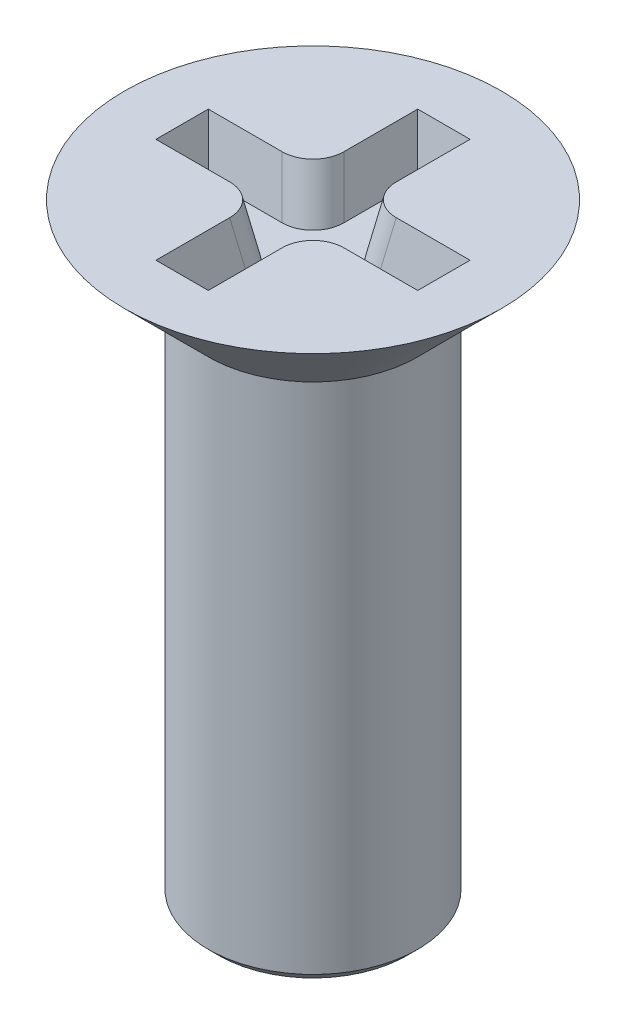
ISO-10303-21;
HEADER;
FILE_DESCRIPTION(('STEP AP214'),'2;1');
FILE_NAME('part.step','',(''),(''),'','','');
FILE_SCHEMA(('AUTOMOTIVE_DESIGN { 1 0 10303 214 1 1 1 1 }'));
ENDSEC;
DATA;
#1=APPLICATION_CONTEXT('core data for automotive mechanical design processes');
#2=APPLICATION_PROTOCOL_DEFINITION('international standard','automotive_design',2000,#1);
#3=PRODUCT_CONTEXT('',#1,'mechanical');
#4=PRODUCT('Part','Part','',(#3));
#5=PRODUCT_RELATED_PRODUCT_CATEGORY('part','',(#4));
#6=PRODUCT_DEFINITION_FORMATION('','',#4);
#7=PRODUCT_DEFINITION_CONTEXT('part definition',#1,'design');
#8=PRODUCT_DEFINITION('design','',#6,#7);
#9=PRODUCT_DEFINITION_SHAPE('','',#8);
#10=(LENGTH_UNIT() NAMED_UNIT(*) SI_UNIT(.MILLI.,.METRE.));
#11=(NAMED_UNIT(*) PLANE_ANGLE_UNIT() SI_UNIT($,.RADIAN.));
#12=(NAMED_UNIT(*) SI_UNIT($,.STERADIAN.) SOLID_ANGLE_UNIT());
#13=UNCERTAINTY_MEASURE_WITH_UNIT(LENGTH_MEASURE(1.E-05),#10,'distance_accuracy_value','');
#14=(GEOMETRIC_REPRESENTATION_CONTEXT(3) GLOBAL_UNCERTAINTY_ASSIGNED_CONTEXT((#13)) GLOBAL_UNIT_ASSIGNED_CONTEXT((#10,
#11,#12)) REPRESENTATION_CONTEXT('',''));
#15=CARTESIAN_POINT('',(0.,0.,0.));
#16=DIRECTION('',(0.,0.,1.));
#17=DIRECTION('',(1.,0.,0.));
#18=AXIS2_PLACEMENT_3D('',#15,#16,#17);
#19=CARTESIAN_POINT('',(0.,0.,0.));
#20=DIRECTION('',(0.,1.,0.));
#21=DIRECTION('',(0.,0.,1.));
#22=AXIS2_PLACEMENT_3D('',#19,#20,#21);
#23=PLANE('',#22);
#24=CARTESIAN_POINT('',(0.,0.,0.));
#25=DIRECTION('',(0.,-1.,0.));
#26=DIRECTION('',(0.,0.,-1.));
#27=AXIS2_PLACEMENT_3D('',#24,#25,#26);
#28=CIRCLE('',#27,1.8);
#29=CARTESIAN_POINT('',(0.,0.,-1.8));
#30=VERTEX_POINT('',#29);
#31=EDGE_CURVE('E257',#30,#30,#28,.T.);
#32=ORIENTED_EDGE('',*,*,#31,.F.);
#33=EDGE_LOOP('',(#32));
#34=FACE_BOUND('',#33,.T.);
#35=DIRECTION('',(1.,0.,0.));
#36=VECTOR('',#35,1.);
#37=CARTESIAN_POINT('',(0.,0.,-0.25));
#38=LINE('',#37,#36);
#39=CARTESIAN_POINT('',(-1.25,0.,-0.25));
#40=VERTEX_POINT('',#39);
#41=CARTESIAN_POINT('',(-0.545442325903662,0.,-0.25));
#42=VERTEX_POINT('',#41);
#43=EDGE_CURVE('E187',#40,#42,#38,.T.);
#44=ORIENTED_EDGE('',*,*,#43,.T.);
#45=CARTESIAN_POINT('',(-0.554627983565723,0.,-0.554627983565723));
#46=DIRECTION('',(0.,1.,0.));
#47=DIRECTION('',(-0.707106781186548,0.,-0.707106781186547));
#48=AXIS2_PLACEMENT_3D('',#45,#46,#47);
#49=ELLIPSE('',#48,0.309186702079241,0.3);
#50=CARTESIAN_POINT('',(-0.25,0.,-0.545442325903662));
#51=VERTEX_POINT('',#50);
#52=EDGE_CURVE('E269',#42,#51,#49,.T.);
#53=ORIENTED_EDGE('',*,*,#52,.T.);
#54=DIRECTION('',(0.,0.,1.));
#55=VECTOR('',#54,1.);
#56=CARTESIAN_POINT('',(-0.25,0.,0.));
#57=LINE('',#56,#55);
#58=CARTESIAN_POINT('',(-0.25,0.,-1.25));
#59=VERTEX_POINT('',#58);
#60=EDGE_CURVE('E185',#59,#51,#57,.T.);
#61=ORIENTED_EDGE('',*,*,#60,.F.);
#62=DIRECTION('',(1.,0.,0.));
#63=VECTOR('',#62,1.);
#64=CARTESIAN_POINT('',(0.,0.,-1.25));
#65=LINE('',#64,#63);
#66=CARTESIAN_POINT('',(0.25,0.,-1.25));
#67=VERTEX_POINT('',#66);
#68=EDGE_CURVE('E164',#59,#67,#65,.T.);
#69=ORIENTED_EDGE('',*,*,#68,.T.);
#70=DIRECTION('',(0.,0.,1.));
#71=VECTOR('',#70,1.);
#72=CARTESIAN_POINT('',(0.25,0.,0.));
#73=LINE('',#72,#71);
#74=CARTESIAN_POINT('',(0.25,0.,-0.545442325903662));
#75=VERTEX_POINT('',#74);
#76=EDGE_CURVE('E176',#67,#75,#73,.T.);
#77=ORIENTED_EDGE('',*,*,#76,.T.);
#78=CARTESIAN_POINT('',(0.554627983565724,0.,-0.554627983565723));
#79=DIRECTION('',(0.,1.,0.));
#80=DIRECTION('',(0.707106781186547,0.,-0.707106781186548));
#81=AXIS2_PLACEMENT_3D('',#78,#79,#80);
#82=ELLIPSE('',#81,0.309186702079241,0.3);
#83=CARTESIAN_POINT('',(0.545442325903663,0.,-0.25));
#84=VERTEX_POINT('',#83);
#85=EDGE_CURVE('E267',#75,#84,#82,.T.);
#86=ORIENTED_EDGE('',*,*,#85,.T.);
#87=DIRECTION('',(1.,0.,0.));
#88=VECTOR('',#87,1.);
#89=CARTESIAN_POINT('',(0.,0.,-0.25));
#90=LINE('',#89,#88);
#91=CARTESIAN_POINT('',(1.25,0.,-0.25));
#92=VERTEX_POINT('',#91);
#93=EDGE_CURVE('E181',#84,#92,#90,.T.);
#94=ORIENTED_EDGE('',*,*,#93,.T.);
#95=DIRECTION('',(0.,0.,-1.));
#96=VECTOR('',#95,1.);
#97=CARTESIAN_POINT('',(1.25,0.,0.));
#98=LINE('',#97,#96);
#99=CARTESIAN_POINT('',(1.25,0.,0.25));
#100=VERTEX_POINT('',#99);
#101=EDGE_CURVE('E207',#100,#92,#98,.T.);
#102=ORIENTED_EDGE('',*,*,#101,.F.);
#103=DIRECTION('',(1.,0.,0.));
#104=VECTOR('',#103,1.);
#105=CARTESIAN_POINT('',(0.,0.,0.25));
#106=LINE('',#105,#104);
#107=CARTESIAN_POINT('',(0.545442325903663,0.,0.25));
#108=VERTEX_POINT('',#107);
#109=EDGE_CURVE('E205',#108,#100,#106,.T.);
#110=ORIENTED_EDGE('',*,*,#109,.F.);
#111=CARTESIAN_POINT('',(0.554627983565724,0.,0.554627983565724));
#112=DIRECTION('',(0.,1.,0.));
#113=DIRECTION('',(0.707106781186548,0.,0.707106781186547));
#114=AXIS2_PLACEMENT_3D('',#111,#112,#113);
#115=ELLIPSE('',#114,0.309186702079241,0.3);
#116=CARTESIAN_POINT('',(0.25,0.,0.545442325903663));
#117=VERTEX_POINT('',#116);
#118=EDGE_CURVE('E263',#108,#117,#115,.T.);
#119=ORIENTED_EDGE('',*,*,#118,.T.);
#120=DIRECTION('',(0.,0.,1.));
#121=VECTOR('',#120,1.);
#122=CARTESIAN_POINT('',(0.25,0.,0.));
#123=LINE('',#122,#121);
#124=CARTESIAN_POINT('',(0.250000000000001,0.,1.25));
#125=VERTEX_POINT('',#124);
#126=EDGE_CURVE('E203',#117,#125,#123,.T.);
#127=ORIENTED_EDGE('',*,*,#126,.T.);
#128=DIRECTION('',(1.,0.,0.));
#129=VECTOR('',#128,1.);
#130=CARTESIAN_POINT('',(0.,0.,1.25));
#131=LINE('',#130,#129);
#132=CARTESIAN_POINT('',(-0.249999999999999,0.,1.25));
#133=VERTEX_POINT('',#132);
#134=EDGE_CURVE('E200',#133,#125,#131,.T.);
#135=ORIENTED_EDGE('',*,*,#134,.F.);
#136=DIRECTION('',(0.,0.,1.));
#137=VECTOR('',#136,1.);
#138=CARTESIAN_POINT('',(-0.25,0.,0.));
#139=LINE('',#138,#137);
#140=CARTESIAN_POINT('',(-0.25,0.,0.545442325903662));
#141=VERTEX_POINT('',#140);
#142=EDGE_CURVE('E198',#141,#133,#139,.T.);
#143=ORIENTED_EDGE('',*,*,#142,.F.);
#144=CARTESIAN_POINT('',(-0.554627983565723,0.,0.554627983565724));
#145=DIRECTION('',(0.,1.,0.));
#146=DIRECTION('',(-0.707106781186547,0.,0.707106781186548));
#147=AXIS2_PLACEMENT_3D('',#144,#145,#146);
#148=ELLIPSE('',#147,0.309186702079241,0.3);
#149=CARTESIAN_POINT('',(-0.545442325903662,0.,0.25));
#150=VERTEX_POINT('',#149);
#151=EDGE_CURVE('E265',#141,#150,#148,.T.);
#152=ORIENTED_EDGE('',*,*,#151,.T.);
#153=DIRECTION('',(1.,0.,0.));
#154=VECTOR('',#153,1.);
#155=CARTESIAN_POINT('',(0.,0.,0.25));
#156=LINE('',#155,#154);
#157=CARTESIAN_POINT('',(-1.25,0.,0.25));
#158=VERTEX_POINT('',#157);
#159=EDGE_CURVE('E195',#158,#150,#156,.T.);
#160=ORIENTED_EDGE('',*,*,#159,.F.);
#161=DIRECTION('',(0.,0.,-1.));
#162=VECTOR('',#161,1.);
#163=CARTESIAN_POINT('',(-1.25,0.,0.));
#164=LINE('',#163,#162);
#165=EDGE_CURVE('E192',#158,#40,#164,.T.);
#166=ORIENTED_EDGE('',*,*,#165,.T.);
#167=EDGE_LOOP('',(#44,#53,#61,#69,#77,#86,#94,#102,#110,#119,#127,#135,#143,#152,#160,#166));
#168=FACE_BOUND('',#167,.T.);
#169=ADVANCED_FACE('F45',(#34,#168),#23,.T.);
#170=CARTESIAN_POINT('',(0.,-0.8,0.));
#171=DIRECTION('',(0.,1.,0.));
#172=DIRECTION('',(0.,0.,1.));
#173=AXIS2_PLACEMENT_3D('',#170,#171,#172);
#174=CONICAL_SURFACE('',#173,1.,0.785398163397448);
#175=ORIENTED_EDGE('',*,*,#31,.T.);
#176=EDGE_LOOP('',(#175));
#177=FACE_BOUND('',#176,.T.);
#178=CARTESIAN_POINT('',(0.,-0.8,0.));
#179=DIRECTION('',(0.,-1.,0.));
#180=DIRECTION('',(0.,0.,-1.));
#181=AXIS2_PLACEMENT_3D('',#178,#179,#180);
#182=CIRCLE('',#181,1.);
#183=CARTESIAN_POINT('',(0.,-0.8,-1.));
#184=VERTEX_POINT('',#183);
#185=EDGE_CURVE('E213',#184,#184,#182,.T.);
#186=ORIENTED_EDGE('',*,*,#185,.F.);
#187=EDGE_LOOP('',(#186));
#188=FACE_BOUND('',#187,.T.);
#189=ADVANCED_FACE('F307',(#177,#188),#174,.T.);
#190=CARTESIAN_POINT('',(0.,-5.8,0.));
#191=DIRECTION('',(0.,1.,0.));
#192=DIRECTION('',(0.,0.,1.));
#193=AXIS2_PLACEMENT_3D('',#190,#191,#192);
#194=CYLINDRICAL_SURFACE('',#193,1.);
#195=CARTESIAN_POINT('',(0.,-5.7,0.));
#196=DIRECTION('',(0.,-1.,0.));
#197=DIRECTION('',(0.,0.,-1.));
#198=AXIS2_PLACEMENT_3D('',#195,#196,#197);
#199=CIRCLE('',#198,1.);
#200=CARTESIAN_POINT('',(0.,-5.7,-1.));
#201=VERTEX_POINT('',#200);
#202=EDGE_CURVE('E11',#201,#201,#199,.F.);
#203=ORIENTED_EDGE('',*,*,#202,.T.);
#204=EDGE_LOOP('',(#203));
#205=FACE_BOUND('',#204,.T.);
#206=ORIENTED_EDGE('',*,*,#185,.T.);
#207=EDGE_LOOP('',(#206));
#208=FACE_BOUND('',#207,.T.);
#209=ADVANCED_FACE('F315',(#205,#208),#194,.T.);
#210=CARTESIAN_POINT('',(0.,-5.8,0.));
#211=DIRECTION('',(0.,-1.,0.));
#212=DIRECTION('',(0.,0.,-1.));
#213=AXIS2_PLACEMENT_3D('',#210,#211,#212);
#214=PLANE('',#213);
#215=CARTESIAN_POINT('',(0.,-5.8,0.));
#216=DIRECTION('',(0.,-1.,0.));
#217=DIRECTION('',(0.,0.,-1.));
#218=AXIS2_PLACEMENT_3D('',#215,#216,#217);
#219=CIRCLE('',#218,0.900000000000001);
#220=CARTESIAN_POINT('',(0.,-5.8,-0.900000000000001));
#221=VERTEX_POINT('',#220);
#222=EDGE_CURVE('E54',#221,#221,#219,.T.);
#223=ORIENTED_EDGE('',*,*,#222,.T.);
#224=EDGE_LOOP('',(#223));
#225=FACE_BOUND('',#224,.T.);
#226=ADVANCED_FACE('F294',(#225),#214,.T.);
#227=CARTESIAN_POINT('',(0.,0.,-0.25));
#228=DIRECTION('',(0.,-0.17364817766693,-0.984807753012208));
#229=DIRECTION('',(0.,0.984807753012208,-0.17364817766693));
#230=AXIS2_PLACEMENT_3D('',#227,#228,#229);
#231=PLANE('',#230);
#232=ORIENTED_EDGE('',*,*,#93,.F.);
#233=DIRECTION('',(-0.171087869746036,-0.970287525247814,0.171087869746036));
#234=VECTOR('',#233,1.);
#235=CARTESIAN_POINT('',(0.529476651306003,-0.0905458400836372,-0.234034325402341));
#236=LINE('',#235,#234);
#237=CARTESIAN_POINT('',(0.45727883554943,-0.5,-0.161836509645767));
#238=VERTEX_POINT('',#237);
#239=EDGE_CURVE('E274',#84,#238,#236,.T.);
#240=ORIENTED_EDGE('',*,*,#239,.T.);
#241=DIRECTION('',(-1.,0.,0.));
#242=VECTOR('',#241,1.);
#243=CARTESIAN_POINT('',(0.,-0.5,-0.161836509645767));
#244=LINE('',#243,#242);
#245=CARTESIAN_POINT('',(1.16183650964577,-0.5,-0.161836509645767));
#246=VERTEX_POINT('',#245);
#247=EDGE_CURVE('E210',#238,#246,#244,.F.);
#248=ORIENTED_EDGE('',*,*,#247,.T.);
#249=DIRECTION('',(-0.171087869746036,-0.970287525247814,0.171087869746036));
#250=VECTOR('',#249,1.);
#251=CARTESIAN_POINT('',(1.2134111760322,-0.207505532169751,-0.213411176032204));
#252=LINE('',#251,#250);
#253=EDGE_CURVE('E211',#246,#92,#252,.F.);
#254=ORIENTED_EDGE('',*,*,#253,.T.);
#255=EDGE_LOOP('',(#232,#240,#248,#254));
#256=FACE_BOUND('',#255,.T.);
#257=ADVANCED_FACE('F364',(#256),#231,.F.);
#258=CARTESIAN_POINT('',(1.25,0.,0.));
#259=DIRECTION('',(0.984807753012208,-0.17364817766693,0.));
#260=DIRECTION('',(0.17364817766693,0.984807753012208,0.));
#261=AXIS2_PLACEMENT_3D('',#258,#259,#260);
#262=PLANE('',#261);
#263=ORIENTED_EDGE('',*,*,#101,.T.);
#264=ORIENTED_EDGE('',*,*,#253,.F.);
#265=DIRECTION('',(0.,0.,-1.));
#266=VECTOR('',#265,1.);
#267=CARTESIAN_POINT('',(1.16183650964577,-0.5,0.));
#268=LINE('',#267,#266);
#269=CARTESIAN_POINT('',(1.16183650964577,-0.5,0.161836509645768));
#270=VERTEX_POINT('',#269);
#271=EDGE_CURVE('E172',#270,#246,#268,.T.);
#272=ORIENTED_EDGE('',*,*,#271,.F.);
#273=DIRECTION('',(0.171087869746036,0.970287525247814,0.171087869746036));
#274=VECTOR('',#273,1.);
#275=CARTESIAN_POINT('',(1.2134111760322,-0.207505532169751,0.213411176032205));
#276=LINE('',#275,#274);
#277=EDGE_CURVE('E214',#270,#100,#276,.T.);
#278=ORIENTED_EDGE('',*,*,#277,.T.);
#279=EDGE_LOOP('',(#263,#264,#272,#278));
#280=FACE_BOUND('',#279,.T.);
#281=ADVANCED_FACE('F359',(#280),#262,.F.);
#282=CARTESIAN_POINT('',(0.,0.,0.25));
#283=DIRECTION('',(0.,-0.17364817766693,0.984807753012208));
#284=DIRECTION('',(0.,-0.984807753012208,-0.17364817766693));
#285=AXIS2_PLACEMENT_3D('',#282,#283,#284);
#286=PLANE('',#285);
#287=DIRECTION('',(1.,0.,0.));
#288=VECTOR('',#287,1.);
#289=CARTESIAN_POINT('',(0.,-0.5,0.161836509645768));
#290=LINE('',#289,#288);
#291=CARTESIAN_POINT('',(0.45727883554943,-0.5,0.161836509645768));
#292=VERTEX_POINT('',#291);
#293=EDGE_CURVE('E233',#292,#270,#290,.T.);
#294=ORIENTED_EDGE('',*,*,#293,.F.);
#295=DIRECTION('',(-0.171087869746036,-0.970287525247814,-0.171087869746036));
#296=VECTOR('',#295,1.);
#297=CARTESIAN_POINT('',(0.536794416099563,-0.049044733649687,0.2413520901959));
#298=LINE('',#297,#296);
#299=EDGE_CURVE('E281',#292,#108,#298,.F.);
#300=ORIENTED_EDGE('',*,*,#299,.T.);
#301=ORIENTED_EDGE('',*,*,#109,.T.);
#302=ORIENTED_EDGE('',*,*,#277,.F.);
#303=EDGE_LOOP('',(#294,#300,#301,#302));
#304=FACE_BOUND('',#303,.T.);
#305=ADVANCED_FACE('F353',(#304),#286,.F.);
#306=CARTESIAN_POINT('',(0.25,0.,0.));
#307=DIRECTION('',(0.984807753012208,-0.17364817766693,0.));
#308=DIRECTION('',(0.17364817766693,0.984807753012208,0.));
#309=AXIS2_PLACEMENT_3D('',#306,#307,#308);
#310=PLANE('',#309);
#311=ORIENTED_EDGE('',*,*,#126,.F.);
#312=DIRECTION('',(0.171087869746036,0.970287525247814,0.171087869746036));
#313=VECTOR('',#312,1.);
#314=CARTESIAN_POINT('',(0.153188599841668,-0.549044733649687,0.44863092574533));
#315=LINE('',#314,#313);
#316=CARTESIAN_POINT('',(0.161836509645768,-0.5,0.45727883554943));
#317=VERTEX_POINT('',#316);
#318=EDGE_CURVE('E61',#117,#317,#315,.F.);
#319=ORIENTED_EDGE('',*,*,#318,.T.);
#320=DIRECTION('',(0.,0.,-1.));
#321=VECTOR('',#320,1.);
#322=CARTESIAN_POINT('',(0.161836509645768,-0.5,0.));
#323=LINE('',#322,#321);
#324=CARTESIAN_POINT('',(0.161836509645768,-0.5,1.16183650964577));
#325=VERTEX_POINT('',#324);
#326=EDGE_CURVE('E235',#317,#325,#323,.F.);
#327=ORIENTED_EDGE('',*,*,#326,.T.);
#328=DIRECTION('',(-0.171087869746036,-0.970287525247814,-0.171087869746036));
#329=VECTOR('',#328,1.);
#330=CARTESIAN_POINT('',(0.213411176032205,-0.207505532169751,1.2134111760322));
#331=LINE('',#330,#329);
#332=EDGE_CURVE('E224',#325,#125,#331,.F.);
#333=ORIENTED_EDGE('',*,*,#332,.T.);
#334=EDGE_LOOP('',(#311,#319,#327,#333));
#335=FACE_BOUND('',#334,.T.);
#336=ADVANCED_FACE('F397',(#335),#310,.F.);
#337=CARTESIAN_POINT('',(0.,0.,1.25));
#338=DIRECTION('',(0.,-0.17364817766693,0.984807753012208));
#339=DIRECTION('',(0.,-0.984807753012208,-0.17364817766693));
#340=AXIS2_PLACEMENT_3D('',#337,#338,#339);
#341=PLANE('',#340);
#342=ORIENTED_EDGE('',*,*,#134,.T.);
#343=ORIENTED_EDGE('',*,*,#332,.F.);
#344=DIRECTION('',(1.,0.,0.));
#345=VECTOR('',#344,1.);
#346=CARTESIAN_POINT('',(0.,-0.5,1.16183650964577));
#347=LINE('',#346,#345);
#348=CARTESIAN_POINT('',(-0.161836509645767,-0.5,1.16183650964577));
#349=VERTEX_POINT('',#348);
#350=EDGE_CURVE('E237',#349,#325,#347,.T.);
#351=ORIENTED_EDGE('',*,*,#350,.F.);
#352=DIRECTION('',(-0.171087869746036,0.970287525247814,0.171087869746036));
#353=VECTOR('',#352,1.);
#354=CARTESIAN_POINT('',(-0.213411176032204,-0.207505532169751,1.2134111760322));
#355=LINE('',#354,#353);
#356=EDGE_CURVE('E221',#349,#133,#355,.T.);
#357=ORIENTED_EDGE('',*,*,#356,.T.);
#358=EDGE_LOOP('',(#342,#343,#351,#357));
#359=FACE_BOUND('',#358,.T.);
#360=ADVANCED_FACE('F349',(#359),#341,.F.);
#361=CARTESIAN_POINT('',(-0.25,0.,0.));
#362=DIRECTION('',(-0.984807753012208,-0.17364817766693,0.));
#363=DIRECTION('',(0.17364817766693,-0.984807753012208,0.));
#364=AXIS2_PLACEMENT_3D('',#361,#362,#363);
#365=PLANE('',#364);
#366=DIRECTION('',(0.,0.,1.));
#367=VECTOR('',#366,1.);
#368=CARTESIAN_POINT('',(-0.161836509645767,-0.5,0.));
#369=LINE('',#368,#367);
#370=CARTESIAN_POINT('',(-0.161836509645767,-0.5,0.45727883554943));
#371=VERTEX_POINT('',#370);
#372=EDGE_CURVE('E240',#371,#349,#369,.T.);
#373=ORIENTED_EDGE('',*,*,#372,.F.);
#374=DIRECTION('',(-0.171087869746036,0.970287525247814,0.171087869746036));
#375=VECTOR('',#374,1.);
#376=CARTESIAN_POINT('',(-0.23403432540234,-0.0905458400836372,0.529476651306003));
#377=LINE('',#376,#375);
#378=EDGE_CURVE('E276',#371,#141,#377,.T.);
#379=ORIENTED_EDGE('',*,*,#378,.T.);
#380=ORIENTED_EDGE('',*,*,#142,.T.);
#381=ORIENTED_EDGE('',*,*,#356,.F.);
#382=EDGE_LOOP('',(#373,#379,#380,#381));
#383=FACE_BOUND('',#382,.T.);
#384=ADVANCED_FACE('F343',(#383),#365,.F.);
#385=CARTESIAN_POINT('',(0.,0.,0.25));
#386=DIRECTION('',(0.,-0.17364817766693,0.984807753012208));
#387=DIRECTION('',(0.,-0.984807753012208,-0.17364817766693));
#388=AXIS2_PLACEMENT_3D('',#385,#386,#387);
#389=PLANE('',#388);
#390=ORIENTED_EDGE('',*,*,#159,.T.);
#391=DIRECTION('',(-0.171087869746036,0.970287525247814,0.171087869746036));
#392=VECTOR('',#391,1.);
#393=CARTESIAN_POINT('',(-0.529476651306003,-0.0905458400836371,0.234034325402341));
#394=LINE('',#393,#392);
#395=CARTESIAN_POINT('',(-0.457278835549429,-0.5,0.161836509645768));
#396=VERTEX_POINT('',#395);
#397=EDGE_CURVE('E279',#150,#396,#394,.F.);
#398=ORIENTED_EDGE('',*,*,#397,.T.);
#399=DIRECTION('',(1.,0.,0.));
#400=VECTOR('',#399,1.);
#401=CARTESIAN_POINT('',(0.,-0.5,0.161836509645768));
#402=LINE('',#401,#400);
#403=CARTESIAN_POINT('',(-1.16183650964577,-0.5,0.161836509645768));
#404=VERTEX_POINT('',#403);
#405=EDGE_CURVE('E242',#404,#396,#402,.T.);
#406=ORIENTED_EDGE('',*,*,#405,.F.);
#407=DIRECTION('',(0.171087869746036,-0.970287525247814,-0.171087869746036));
#408=VECTOR('',#407,1.);
#409=CARTESIAN_POINT('',(-1.2134111760322,-0.207505532169751,0.213411176032205));
#410=LINE('',#409,#408);
#411=EDGE_CURVE('E219',#404,#158,#410,.F.);
#412=ORIENTED_EDGE('',*,*,#411,.T.);
#413=EDGE_LOOP('',(#390,#398,#406,#412));
#414=FACE_BOUND('',#413,.T.);
#415=ADVANCED_FACE('F388',(#414),#389,.F.);
#416=CARTESIAN_POINT('',(-1.25,0.,0.));
#417=DIRECTION('',(-0.984807753012208,-0.17364817766693,0.));
#418=DIRECTION('',(0.17364817766693,-0.984807753012208,0.));
#419=AXIS2_PLACEMENT_3D('',#416,#417,#418);
#420=PLANE('',#419);
#421=ORIENTED_EDGE('',*,*,#165,.F.);
#422=ORIENTED_EDGE('',*,*,#411,.F.);
#423=DIRECTION('',(0.,0.,1.));
#424=VECTOR('',#423,1.);
#425=CARTESIAN_POINT('',(-1.16183650964577,-0.5,0.));
#426=LINE('',#425,#424);
#427=CARTESIAN_POINT('',(-1.16183650964577,-0.5,-0.161836509645767));
#428=VERTEX_POINT('',#427);
#429=EDGE_CURVE('E245',#404,#428,#426,.F.);
#430=ORIENTED_EDGE('',*,*,#429,.T.);
#431=DIRECTION('',(-0.171087869746036,0.970287525247814,-0.171087869746036));
#432=VECTOR('',#431,1.);
#433=CARTESIAN_POINT('',(-1.2134111760322,-0.207505532169751,-0.213411176032204));
#434=LINE('',#433,#432);
#435=EDGE_CURVE('E217',#428,#40,#434,.T.);
#436=ORIENTED_EDGE('',*,*,#435,.T.);
#437=EDGE_LOOP('',(#421,#422,#430,#436));
#438=FACE_BOUND('',#437,.T.);
#439=ADVANCED_FACE('F384',(#438),#420,.F.);
#440=CARTESIAN_POINT('',(0.,0.,-0.25));
#441=DIRECTION('',(0.,-0.17364817766693,-0.984807753012208));
#442=DIRECTION('',(0.,0.984807753012208,-0.17364817766693));
#443=AXIS2_PLACEMENT_3D('',#440,#441,#442);
#444=PLANE('',#443);
#445=DIRECTION('',(-1.,0.,0.));
#446=VECTOR('',#445,1.);
#447=CARTESIAN_POINT('',(0.,-0.5,-0.161836509645767));
#448=LINE('',#447,#446);
#449=CARTESIAN_POINT('',(-0.457278835549429,-0.5,-0.161836509645767));
#450=VERTEX_POINT('',#449);
#451=EDGE_CURVE('E247',#428,#450,#448,.F.);
#452=ORIENTED_EDGE('',*,*,#451,.T.);
#453=DIRECTION('',(-0.171087869746036,0.970287525247814,-0.171087869746036));
#454=VECTOR('',#453,1.);
#455=CARTESIAN_POINT('',(-0.536794416099562,-0.0490447336496869,-0.2413520901959));
#456=LINE('',#455,#454);
#457=EDGE_CURVE('E260',#450,#42,#456,.T.);
#458=ORIENTED_EDGE('',*,*,#457,.T.);
#459=ORIENTED_EDGE('',*,*,#43,.F.);
#460=ORIENTED_EDGE('',*,*,#435,.F.);
#461=EDGE_LOOP('',(#452,#458,#459,#460));
#462=FACE_BOUND('',#461,.T.);
#463=ADVANCED_FACE('F380',(#462),#444,.F.);
#464=CARTESIAN_POINT('',(-0.25,0.,0.));
#465=DIRECTION('',(-0.984807753012208,-0.17364817766693,0.));
#466=DIRECTION('',(0.17364817766693,-0.984807753012208,0.));
#467=AXIS2_PLACEMENT_3D('',#464,#465,#466);
#468=PLANE('',#467);
#469=ORIENTED_EDGE('',*,*,#60,.T.);
#470=DIRECTION('',(0.171087869746036,-0.970287525247814,0.171087869746036));
#471=VECTOR('',#470,1.);
#472=CARTESIAN_POINT('',(-0.153188599841667,-0.549044733649687,-0.44863092574533));
#473=LINE('',#472,#471);
#474=CARTESIAN_POINT('',(-0.161836509645767,-0.5,-0.45727883554943));
#475=VERTEX_POINT('',#474);
#476=EDGE_CURVE('E271',#51,#475,#473,.T.);
#477=ORIENTED_EDGE('',*,*,#476,.T.);
#478=DIRECTION('',(0.,0.,1.));
#479=VECTOR('',#478,1.);
#480=CARTESIAN_POINT('',(-0.161836509645767,-0.5,0.));
#481=LINE('',#480,#479);
#482=CARTESIAN_POINT('',(-0.161836509645767,-0.5,-1.16183650964577));
#483=VERTEX_POINT('',#482);
#484=EDGE_CURVE('E250',#483,#475,#481,.T.);
#485=ORIENTED_EDGE('',*,*,#484,.F.);
#486=DIRECTION('',(0.171087869746036,-0.970287525247814,0.171087869746036));
#487=VECTOR('',#486,1.);
#488=CARTESIAN_POINT('',(-0.213411176032204,-0.207505532169751,-1.2134111760322));
#489=LINE('',#488,#487);
#490=EDGE_CURVE('E171',#483,#59,#489,.F.);
#491=ORIENTED_EDGE('',*,*,#490,.T.);
#492=EDGE_LOOP('',(#469,#477,#485,#491));
#493=FACE_BOUND('',#492,.T.);
#494=ADVANCED_FACE('F377',(#493),#468,.F.);
#495=CARTESIAN_POINT('',(0.,0.,-1.25));
#496=DIRECTION('',(0.,-0.17364817766693,-0.984807753012208));
#497=DIRECTION('',(0.,0.984807753012208,-0.17364817766693));
#498=AXIS2_PLACEMENT_3D('',#495,#496,#497);
#499=PLANE('',#498);
#500=ORIENTED_EDGE('',*,*,#68,.F.);
#501=ORIENTED_EDGE('',*,*,#490,.F.);
#502=DIRECTION('',(-1.,0.,0.));
#503=VECTOR('',#502,1.);
#504=CARTESIAN_POINT('',(0.,-0.5,-1.16183650964577));
#505=LINE('',#504,#503);
#506=CARTESIAN_POINT('',(0.161836509645768,-0.5,-1.16183650964577));
#507=VERTEX_POINT('',#506);
#508=EDGE_CURVE('E167',#483,#507,#505,.F.);
#509=ORIENTED_EDGE('',*,*,#508,.T.);
#510=DIRECTION('',(0.171087869746036,0.970287525247814,-0.171087869746036));
#511=VECTOR('',#510,1.);
#512=CARTESIAN_POINT('',(0.213411176032205,-0.207505532169751,-1.2134111760322));
#513=LINE('',#512,#511);
#514=EDGE_CURVE('E160',#507,#67,#513,.T.);
#515=ORIENTED_EDGE('',*,*,#514,.T.);
#516=EDGE_LOOP('',(#500,#501,#509,#515));
#517=FACE_BOUND('',#516,.T.);
#518=ADVANCED_FACE('F162',(#517),#499,.F.);
#519=CARTESIAN_POINT('',(0.25,0.,0.));
#520=DIRECTION('',(0.984807753012208,-0.17364817766693,0.));
#521=DIRECTION('',(0.17364817766693,0.984807753012208,0.));
#522=AXIS2_PLACEMENT_3D('',#519,#520,#521);
#523=PLANE('',#522);
#524=DIRECTION('',(0.,0.,-1.));
#525=VECTOR('',#524,1.);
#526=CARTESIAN_POINT('',(0.161836509645768,-0.5,0.));
#527=LINE('',#526,#525);
#528=CARTESIAN_POINT('',(0.161836509645768,-0.5,-0.45727883554943));
#529=VERTEX_POINT('',#528);
#530=EDGE_CURVE('E230',#507,#529,#527,.F.);
#531=ORIENTED_EDGE('',*,*,#530,.T.);
#532=DIRECTION('',(-0.171087869746036,-0.970287525247814,0.171087869746036));
#533=VECTOR('',#532,1.);
#534=CARTESIAN_POINT('',(0.234034325402341,-0.0905458400836371,-0.529476651306003));
#535=LINE('',#534,#533);
#536=EDGE_CURVE('E179',#529,#75,#535,.F.);
#537=ORIENTED_EDGE('',*,*,#536,.T.);
#538=ORIENTED_EDGE('',*,*,#76,.F.);
#539=ORIENTED_EDGE('',*,*,#514,.F.);
#540=EDGE_LOOP('',(#531,#537,#538,#539));
#541=FACE_BOUND('',#540,.T.);
#542=ADVANCED_FACE('F177',(#541),#523,.F.);
#543=CARTESIAN_POINT('',(0.,-0.5,0.));
#544=DIRECTION('',(0.,1.,0.));
#545=DIRECTION('',(0.,0.,1.));
#546=AXIS2_PLACEMENT_3D('',#543,#544,#545);
#547=PLANE('',#546);
#548=ORIENTED_EDGE('',*,*,#247,.F.);
#549=CARTESIAN_POINT('',(0.466464493211491,-0.5,-0.466464493211491));
#550=DIRECTION('',(0.,1.,0.));
#551=DIRECTION('',(0.707106781186547,0.,-0.707106781186548));
#552=AXIS2_PLACEMENT_3D('',#549,#550,#551);
#553=ELLIPSE('',#552,0.309186702079241,0.3);
#554=EDGE_CURVE('E287',#238,#529,#553,.F.);
#555=ORIENTED_EDGE('',*,*,#554,.T.);
#556=ORIENTED_EDGE('',*,*,#530,.F.);
#557=ORIENTED_EDGE('',*,*,#508,.F.);
#558=ORIENTED_EDGE('',*,*,#484,.T.);
#559=CARTESIAN_POINT('',(-0.466464493211491,-0.5,-0.466464493211491));
#560=DIRECTION('',(0.,1.,0.));
#561=DIRECTION('',(-0.707106781186548,0.,-0.707106781186547));
#562=AXIS2_PLACEMENT_3D('',#559,#560,#561);
#563=ELLIPSE('',#562,0.309186702079241,0.3);
#564=EDGE_CURVE('E285',#475,#450,#563,.F.);
#565=ORIENTED_EDGE('',*,*,#564,.T.);
#566=ORIENTED_EDGE('',*,*,#451,.F.);
#567=ORIENTED_EDGE('',*,*,#429,.F.);
#568=ORIENTED_EDGE('',*,*,#405,.T.);
#569=CARTESIAN_POINT('',(-0.46646449321149,-0.5,0.466464493211491));
#570=DIRECTION('',(0.,1.,0.));
#571=DIRECTION('',(-0.707106781186547,0.,0.707106781186548));
#572=AXIS2_PLACEMENT_3D('',#569,#570,#571);
#573=ELLIPSE('',#572,0.309186702079241,0.3);
#574=EDGE_CURVE('E289',#396,#371,#573,.F.);
#575=ORIENTED_EDGE('',*,*,#574,.T.);
#576=ORIENTED_EDGE('',*,*,#372,.T.);
#577=ORIENTED_EDGE('',*,*,#350,.T.);
#578=ORIENTED_EDGE('',*,*,#326,.F.);
#579=CARTESIAN_POINT('',(0.466464493211491,-0.5,0.466464493211491));
#580=DIRECTION('',(0.,1.,0.));
#581=DIRECTION('',(0.707106781186548,0.,0.707106781186547));
#582=AXIS2_PLACEMENT_3D('',#579,#580,#581);
#583=ELLIPSE('',#582,0.309186702079241,0.3);
#584=EDGE_CURVE('E68',#317,#292,#583,.F.);
#585=ORIENTED_EDGE('',*,*,#584,.T.);
#586=ORIENTED_EDGE('',*,*,#293,.T.);
#587=ORIENTED_EDGE('',*,*,#271,.T.);
#588=EDGE_LOOP('',(#548,#555,#556,#557,#558,#565,#566,#567,#568,#575,#576,#577,#578,#585,#586,#587));
#589=FACE_BOUND('',#588,.T.);
#590=ADVANCED_FACE('F325',(#589),#547,.T.);
#591=CARTESIAN_POINT('',(-0.529476651306003,-0.142640293383716,-0.529476651306003));
#592=DIRECTION('',(-0.171087869746036,0.970287525247814,-0.171087869746036));
#593=DIRECTION('',(-0.984807753012208,-0.17364817766693,0.));
#594=AXIS2_PLACEMENT_3D('',#591,#592,#593);
#595=CYLINDRICAL_SURFACE('',#594,0.3);
#596=ORIENTED_EDGE('',*,*,#564,.F.);
#597=ORIENTED_EDGE('',*,*,#476,.F.);
#598=ORIENTED_EDGE('',*,*,#52,.F.);
#599=ORIENTED_EDGE('',*,*,#457,.F.);
#600=EDGE_LOOP('',(#596,#597,#598,#599));
#601=FACE_BOUND('',#600,.T.);
#602=ADVANCED_FACE('F321',(#601),#595,.T.);
#603=CARTESIAN_POINT('',(0.529476651306003,-0.142640293383716,-0.529476651306003));
#604=DIRECTION('',(0.171087869746036,0.970287525247814,-0.171087869746036));
#605=DIRECTION('',(0.,0.17364817766693,0.984807753012208));
#606=AXIS2_PLACEMENT_3D('',#603,#604,#605);
#607=CYLINDRICAL_SURFACE('',#606,0.3);
#608=ORIENTED_EDGE('',*,*,#554,.F.);
#609=ORIENTED_EDGE('',*,*,#239,.F.);
#610=ORIENTED_EDGE('',*,*,#85,.F.);
#611=ORIENTED_EDGE('',*,*,#536,.F.);
#612=EDGE_LOOP('',(#608,#609,#610,#611));
#613=FACE_BOUND('',#612,.T.);
#614=ADVANCED_FACE('F324',(#613),#607,.T.);
#615=CARTESIAN_POINT('',(-0.529476651306003,-0.142640293383716,0.529476651306003));
#616=DIRECTION('',(-0.171087869746036,0.970287525247814,0.171087869746036));
#617=DIRECTION('',(0.,-0.17364817766693,0.984807753012208));
#618=AXIS2_PLACEMENT_3D('',#615,#616,#617);
#619=CYLINDRICAL_SURFACE('',#618,0.3);
#620=ORIENTED_EDGE('',*,*,#574,.F.);
#621=ORIENTED_EDGE('',*,*,#397,.F.);
#622=ORIENTED_EDGE('',*,*,#151,.F.);
#623=ORIENTED_EDGE('',*,*,#378,.F.);
#624=EDGE_LOOP('',(#620,#621,#622,#623));
#625=FACE_BOUND('',#624,.T.);
#626=ADVANCED_FACE('F303',(#625),#619,.T.);
#627=CARTESIAN_POINT('',(0.529476651306004,-0.142640293383716,0.529476651306003));
#628=DIRECTION('',(0.171087869746036,0.970287525247814,0.171087869746036));
#629=DIRECTION('',(-0.984807753012208,0.17364817766693,0.));
#630=AXIS2_PLACEMENT_3D('',#627,#628,#629);
#631=CYLINDRICAL_SURFACE('',#630,0.3);
#632=ORIENTED_EDGE('',*,*,#584,.F.);
#633=ORIENTED_EDGE('',*,*,#318,.F.);
#634=ORIENTED_EDGE('',*,*,#118,.F.);
#635=ORIENTED_EDGE('',*,*,#299,.F.);
#636=EDGE_LOOP('',(#632,#633,#634,#635));
#637=FACE_BOUND('',#636,.T.);
#638=ADVANCED_FACE('F297',(#637),#631,.T.);
#639=CARTESIAN_POINT('',(0.,-5.8,0.));
#640=DIRECTION('',(0.,1.,0.));
#641=DIRECTION('',(0.,0.,1.));
#642=AXIS2_PLACEMENT_3D('',#639,#640,#641);
#643=CONICAL_SURFACE('',#642,0.900000000000001,0.785398163397444);
#644=ORIENTED_EDGE('',*,*,#202,.F.);
#645=EDGE_LOOP('',(#644));
#646=FACE_BOUND('',#645,.T.);
#647=ORIENTED_EDGE('',*,*,#222,.F.);
#648=EDGE_LOOP('',(#647));
#649=FACE_BOUND('',#648,.T.);
#650=ADVANCED_FACE('F48',(#646,#649),#643,.T.);
#651=CLOSED_SHELL('',(#169,#189,#209,#226,#257,#281,#305,#336,#360,#384,#415,#439,#463,#494,
#518,#542,#590,#602,#614,#626,#638,#650));
#652=MANIFOLD_SOLID_BREP('B2',#651);
#653=ADVANCED_BREP_SHAPE_REPRESENTATION('',(#18,#652),#14);
#654=SHAPE_DEFINITION_REPRESENTATION(#9,#653);
ENDSEC;
END-ISO-10303-21;
